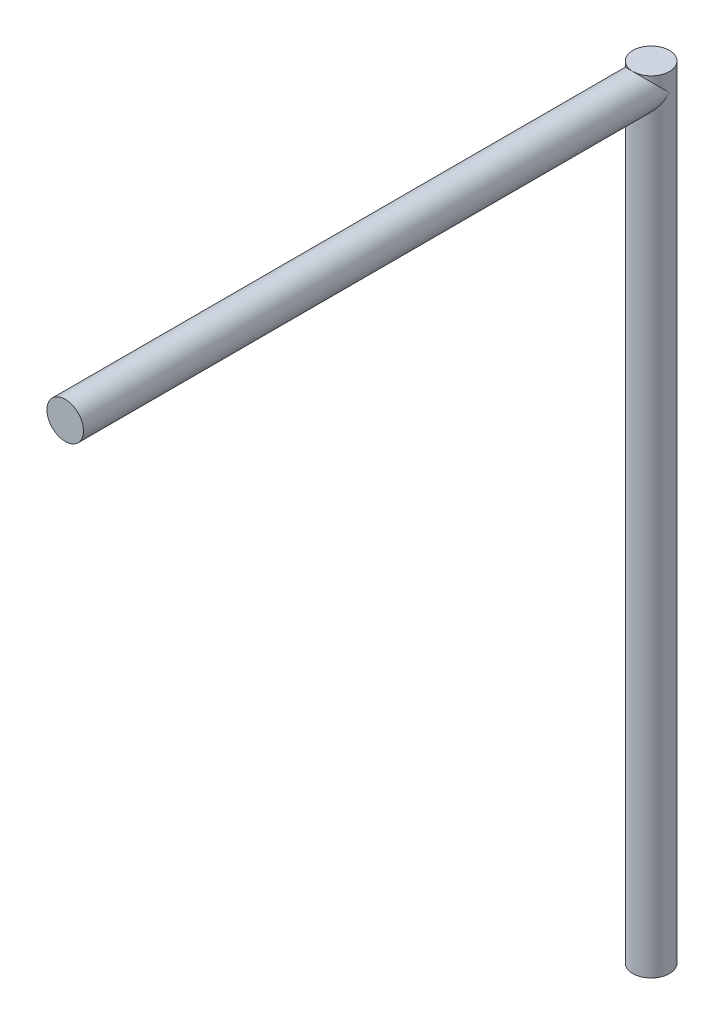
ISO-10303-21;
HEADER;
FILE_DESCRIPTION(('STEP AP214'),'2;1');
FILE_NAME('part.step','',(''),(''),'','','');
FILE_SCHEMA(('AUTOMOTIVE_DESIGN { 1 0 10303 214 1 1 1 1 }'));
ENDSEC;
DATA;
#1=APPLICATION_CONTEXT('core data for automotive mechanical design processes');
#2=APPLICATION_PROTOCOL_DEFINITION('international standard','automotive_design',2000,#1);
#3=PRODUCT_CONTEXT('',#1,'mechanical');
#4=PRODUCT('Part','Part','',(#3));
#5=PRODUCT_RELATED_PRODUCT_CATEGORY('part','',(#4));
#6=PRODUCT_DEFINITION_FORMATION('','',#4);
#7=PRODUCT_DEFINITION_CONTEXT('part definition',#1,'design');
#8=PRODUCT_DEFINITION('design','',#6,#7);
#9=PRODUCT_DEFINITION_SHAPE('','',#8);
#10=(LENGTH_UNIT() NAMED_UNIT(*) SI_UNIT(.MILLI.,.METRE.));
#11=(NAMED_UNIT(*) PLANE_ANGLE_UNIT() SI_UNIT($,.RADIAN.));
#12=(NAMED_UNIT(*) SI_UNIT($,.STERADIAN.) SOLID_ANGLE_UNIT());
#13=UNCERTAINTY_MEASURE_WITH_UNIT(LENGTH_MEASURE(1.E-05),#10,'distance_accuracy_value','');
#14=(GEOMETRIC_REPRESENTATION_CONTEXT(3) GLOBAL_UNCERTAINTY_ASSIGNED_CONTEXT((#13)) GLOBAL_UNIT_ASSIGNED_CONTEXT((#10,
#11,#12)) REPRESENTATION_CONTEXT('',''));
#15=CARTESIAN_POINT('',(0.,0.,0.));
#16=DIRECTION('',(0.,0.,1.));
#17=DIRECTION('',(1.,0.,0.));
#18=AXIS2_PLACEMENT_3D('',#15,#16,#17);
#19=CARTESIAN_POINT('',(0.,203.2,0.));
#20=DIRECTION('',(0.,-1.,0.));
#21=DIRECTION('',(0.,0.,-1.));
#22=AXIS2_PLACEMENT_3D('',#19,#20,#21);
#23=CYLINDRICAL_SURFACE('',#22,4.7625);
#24=CARTESIAN_POINT('',(0.,0.,0.));
#25=DIRECTION('',(0.,1.,0.));
#26=DIRECTION('',(0.,0.,1.));
#27=AXIS2_PLACEMENT_3D('',#24,#25,#26);
#28=CIRCLE('',#27,4.7625);
#29=CARTESIAN_POINT('',(0.,0.,4.7625));
#30=VERTEX_POINT('',#29);
#31=EDGE_CURVE('E43',#30,#30,#28,.T.);
#32=ORIENTED_EDGE('',*,*,#31,.T.);
#33=EDGE_LOOP('',(#32));
#34=FACE_BOUND('',#33,.T.);
#35=CARTESIAN_POINT('',(0.,198.4375,0.));
#36=DIRECTION('',(0.,-0.707106781186548,-0.707106781186547));
#37=DIRECTION('',(0.,-0.707106781186548,0.707106781186547));
#38=AXIS2_PLACEMENT_3D('',#35,#36,#37);
#39=ELLIPSE('',#38,6.73519209080187,4.7625);
#40=CARTESIAN_POINT('',(-4.7625,198.4375,0.));
#41=VERTEX_POINT('',#40);
#42=CARTESIAN_POINT('',(4.7625,198.4375,0.));
#43=VERTEX_POINT('',#42);
#44=EDGE_CURVE('E61',#41,#43,#39,.F.);
#45=ORIENTED_EDGE('',*,*,#44,.F.);
#46=CARTESIAN_POINT('',(0.,198.4375,0.));
#47=DIRECTION('',(0.,-0.707106781186548,0.707106781186547));
#48=DIRECTION('',(0.,-0.707106781186548,-0.707106781186547));
#49=AXIS2_PLACEMENT_3D('',#46,#47,#48);
#50=ELLIPSE('',#49,6.73519209080187,4.7625);
#51=CARTESIAN_POINT('',(0.,203.2,4.7625));
#52=VERTEX_POINT('',#51);
#53=EDGE_CURVE('E59',#52,#41,#50,.T.);
#54=ORIENTED_EDGE('',*,*,#53,.F.);
#55=CARTESIAN_POINT('',(0.,203.2,0.));
#56=DIRECTION('',(0.,1.,0.));
#57=DIRECTION('',(0.,0.,1.));
#58=AXIS2_PLACEMENT_3D('',#55,#56,#57);
#59=CIRCLE('',#58,4.7625);
#60=EDGE_CURVE('E11',#52,#52,#59,.T.);
#61=ORIENTED_EDGE('',*,*,#60,.F.);
#62=EDGE_CURVE('E54',#43,#52,#50,.T.);
#63=ORIENTED_EDGE('',*,*,#62,.F.);
#64=EDGE_LOOP('',(#45,#54,#61,#63));
#65=FACE_BOUND('',#64,.T.);
#66=ADVANCED_FACE('F40',(#34,#65),#23,.T.);
#67=CARTESIAN_POINT('',(0.,203.2,0.));
#68=DIRECTION('',(0.,1.,0.));
#69=DIRECTION('',(0.,0.,1.));
#70=AXIS2_PLACEMENT_3D('',#67,#68,#69);
#71=PLANE('',#70);
#72=ORIENTED_EDGE('',*,*,#60,.T.);
#73=EDGE_LOOP('',(#72));
#74=FACE_BOUND('',#73,.T.);
#75=ADVANCED_FACE('F75',(#74),#71,.T.);
#76=CARTESIAN_POINT('',(0.,0.,0.));
#77=DIRECTION('',(0.,1.,0.));
#78=DIRECTION('',(0.,0.,1.));
#79=AXIS2_PLACEMENT_3D('',#76,#77,#78);
#80=PLANE('',#79);
#81=ORIENTED_EDGE('',*,*,#31,.F.);
#82=EDGE_LOOP('',(#81));
#83=FACE_BOUND('',#82,.T.);
#84=ADVANCED_FACE('F73',(#83),#80,.F.);
#85=CARTESIAN_POINT('',(0.,198.4375,152.4));
#86=DIRECTION('',(0.,0.,-1.));
#87=DIRECTION('',(-1.,0.,0.));
#88=AXIS2_PLACEMENT_3D('',#85,#86,#87);
#89=CYLINDRICAL_SURFACE('',#88,4.7625);
#90=CARTESIAN_POINT('',(0.,198.4375,152.4));
#91=DIRECTION('',(0.,0.,1.));
#92=DIRECTION('',(1.,0.,0.));
#93=AXIS2_PLACEMENT_3D('',#90,#91,#92);
#94=CIRCLE('',#93,4.7625);
#95=CARTESIAN_POINT('',(4.7625,198.4375,152.4));
#96=VERTEX_POINT('',#95);
#97=EDGE_CURVE('E65',#96,#96,#94,.T.);
#98=ORIENTED_EDGE('',*,*,#97,.F.);
#99=EDGE_LOOP('',(#98));
#100=FACE_BOUND('',#99,.T.);
#101=ORIENTED_EDGE('',*,*,#44,.T.);
#102=ORIENTED_EDGE('',*,*,#62,.T.);
#103=ORIENTED_EDGE('',*,*,#53,.T.);
#104=EDGE_LOOP('',(#101,#102,#103));
#105=FACE_BOUND('',#104,.T.);
#106=ADVANCED_FACE('F64',(#100,#105),#89,.T.);
#107=CARTESIAN_POINT('',(0.,198.4375,152.4));
#108=DIRECTION('',(0.,0.,1.));
#109=DIRECTION('',(1.,0.,0.));
#110=AXIS2_PLACEMENT_3D('',#107,#108,#109);
#111=PLANE('',#110);
#112=ORIENTED_EDGE('',*,*,#97,.T.);
#113=EDGE_LOOP('',(#112));
#114=FACE_BOUND('',#113,.T.);
#115=ADVANCED_FACE('F80',(#114),#111,.T.);
#116=CLOSED_SHELL('',(#66,#75,#84,#106,#115));
#117=MANIFOLD_SOLID_BREP('B2',#116);
#118=ADVANCED_BREP_SHAPE_REPRESENTATION('',(#18,#117),#14);
#119=SHAPE_DEFINITION_REPRESENTATION(#9,#118);
ENDSEC;
END-ISO-10303-21;
